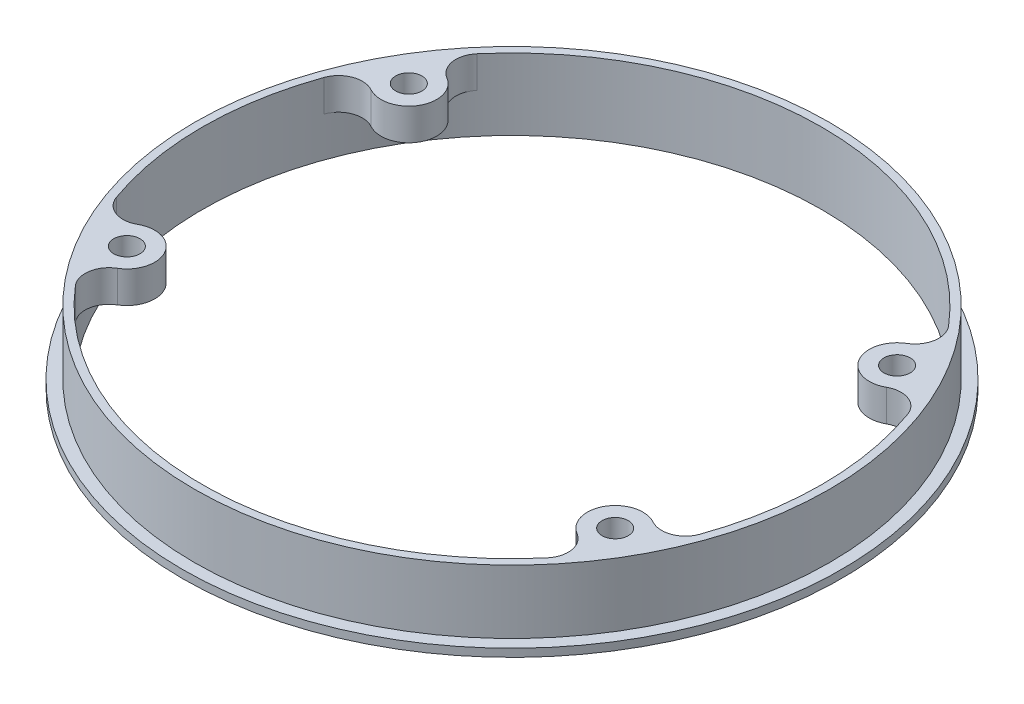
ISO-10303-21;
HEADER;
FILE_DESCRIPTION(('STEP AP214'),'2;1');
FILE_NAME('part.step','',(''),(''),'','','');
FILE_SCHEMA(('AUTOMOTIVE_DESIGN { 1 0 10303 214 1 1 1 1 }'));
ENDSEC;
DATA;
#1=APPLICATION_CONTEXT('core data for automotive mechanical design processes');
#2=APPLICATION_PROTOCOL_DEFINITION('international standard','automotive_design',2000,#1);
#3=PRODUCT_CONTEXT('',#1,'mechanical');
#4=PRODUCT('Part','Part','',(#3));
#5=PRODUCT_RELATED_PRODUCT_CATEGORY('part','',(#4));
#6=PRODUCT_DEFINITION_FORMATION('','',#4);
#7=PRODUCT_DEFINITION_CONTEXT('part definition',#1,'design');
#8=PRODUCT_DEFINITION('design','',#6,#7);
#9=PRODUCT_DEFINITION_SHAPE('','',#8);
#10=(LENGTH_UNIT() NAMED_UNIT(*) SI_UNIT(.MILLI.,.METRE.));
#11=(NAMED_UNIT(*) PLANE_ANGLE_UNIT() SI_UNIT($,.RADIAN.));
#12=(NAMED_UNIT(*) SI_UNIT($,.STERADIAN.) SOLID_ANGLE_UNIT());
#13=UNCERTAINTY_MEASURE_WITH_UNIT(LENGTH_MEASURE(1.E-05),#10,'distance_accuracy_value','');
#14=(GEOMETRIC_REPRESENTATION_CONTEXT(3) GLOBAL_UNCERTAINTY_ASSIGNED_CONTEXT((#13)) GLOBAL_UNIT_ASSIGNED_CONTEXT((#10,
#11,#12)) REPRESENTATION_CONTEXT('',''));
#15=CARTESIAN_POINT('',(0.,0.,0.));
#16=DIRECTION('',(0.,0.,1.));
#17=DIRECTION('',(1.,0.,0.));
#18=AXIS2_PLACEMENT_3D('',#15,#16,#17);
#19=CARTESIAN_POINT('',(-32.,5.,0.));
#20=DIRECTION('',(0.,1.,0.));
#21=DIRECTION('',(0.,0.,1.));
#22=AXIS2_PLACEMENT_3D('',#19,#20,#21);
#23=PLANE('',#22);
#24=CARTESIAN_POINT('',(-30.7439018343476,5.,-17.75));
#25=DIRECTION('',(0.,1.,0.));
#26=DIRECTION('',(0.,0.,1.));
#27=AXIS2_PLACEMENT_3D('',#24,#25,#26);
#28=CIRCLE('',#27,1.65);
#29=CARTESIAN_POINT('',(-30.7439018343476,5.,-16.1));
#30=VERTEX_POINT('',#29);
#31=EDGE_CURVE('E268',#30,#30,#28,.T.);
#32=ORIENTED_EDGE('',*,*,#31,.T.);
#33=EDGE_LOOP('',(#32));
#34=FACE_BOUND('',#33,.T.);
#35=CARTESIAN_POINT('',(-30.7439018343476,5.,-17.75));
#36=DIRECTION('',(0.,1.,0.));
#37=DIRECTION('',(0.,0.,1.));
#38=AXIS2_PLACEMENT_3D('',#35,#36,#37);
#39=CIRCLE('',#38,3.50000000000001);
#40=CARTESIAN_POINT('',(-28.9513840264837,5.,-20.7561403673965));
#41=VERTEX_POINT('',#40);
#42=CARTESIAN_POINT('',(-32.4510368559229,5.,-14.6945638579556));
#43=VERTEX_POINT('',#42);
#44=EDGE_CURVE('E11',#41,#43,#39,.F.);
#45=ORIENTED_EDGE('',*,*,#44,.T.);
#46=CARTESIAN_POINT('',(-33.9142954458446,5.,-12.0756185933461));
#47=DIRECTION('',(0.,1.,0.));
#48=DIRECTION('',(0.,0.,1.));
#49=AXIS2_PLACEMENT_3D('',#46,#47,#48);
#50=CIRCLE('',#49,3.);
#51=CARTESIAN_POINT('',(-36.7404867329983,5.,-13.0819201427917));
#52=VERTEX_POINT('',#51);
#53=EDGE_CURVE('E262',#43,#52,#50,.T.);
#54=ORIENTED_EDGE('',*,*,#53,.T.);
#55=CARTESIAN_POINT('',(0.,5.,0.));
#56=DIRECTION('',(0.,-1.,0.));
#57=DIRECTION('',(0.,0.,-1.));
#58=AXIS2_PLACEMENT_3D('',#55,#56,#57);
#59=CIRCLE('',#58,39.);
#60=CARTESIAN_POINT('',(-29.699518540436,5.,-25.2772347867858));
#61=VERTEX_POINT('',#60);
#62=EDGE_CURVE('E295',#52,#61,#59,.T.);
#63=ORIENTED_EDGE('',*,*,#62,.T.);
#64=CARTESIAN_POINT('',(-27.4149401911717,5.,-23.3328321108792));
#65=DIRECTION('',(0.,1.,0.));
#66=DIRECTION('',(0.,0.,1.));
#67=AXIS2_PLACEMENT_3D('',#64,#65,#66);
#68=CIRCLE('',#67,3.);
#69=EDGE_CURVE('E259',#61,#41,#68,.T.);
#70=ORIENTED_EDGE('',*,*,#69,.T.);
#71=EDGE_LOOP('',(#45,#54,#63,#70));
#72=FACE_BOUND('',#71,.T.);
#73=ADVANCED_FACE('F38',(#34,#72),#23,.F.);
#74=CARTESIAN_POINT('',(30.7439018343476,5.,-17.75));
#75=DIRECTION('',(0.,1.,0.));
#76=DIRECTION('',(0.,0.,1.));
#77=AXIS2_PLACEMENT_3D('',#74,#75,#76);
#78=CIRCLE('',#77,1.65);
#79=CARTESIAN_POINT('',(30.7439018343476,5.,-16.1));
#80=VERTEX_POINT('',#79);
#81=EDGE_CURVE('E280',#80,#80,#78,.T.);
#82=ORIENTED_EDGE('',*,*,#81,.T.);
#83=EDGE_LOOP('',(#82));
#84=FACE_BOUND('',#83,.T.);
#85=CARTESIAN_POINT('',(30.7439018343477,5.,-17.7499999999999));
#86=DIRECTION('',(0.,1.,0.));
#87=DIRECTION('',(0.,0.,1.));
#88=AXIS2_PLACEMENT_3D('',#85,#86,#87);
#89=CIRCLE('',#88,3.50000000000001);
#90=CARTESIAN_POINT('',(32.4510368559229,5.,-14.6945638579555));
#91=VERTEX_POINT('',#90);
#92=CARTESIAN_POINT('',(28.9513840264838,5.,-20.7561403673964));
#93=VERTEX_POINT('',#92);
#94=EDGE_CURVE('E46',#91,#93,#89,.F.);
#95=ORIENTED_EDGE('',*,*,#94,.T.);
#96=CARTESIAN_POINT('',(27.4149401911718,5.,-23.3328321108791));
#97=DIRECTION('',(0.,1.,0.));
#98=DIRECTION('',(0.,0.,1.));
#99=AXIS2_PLACEMENT_3D('',#96,#97,#98);
#100=CIRCLE('',#99,3.);
#101=CARTESIAN_POINT('',(29.6995185404362,5.,-25.2772347867857));
#102=VERTEX_POINT('',#101);
#103=EDGE_CURVE('E256',#93,#102,#100,.T.);
#104=ORIENTED_EDGE('',*,*,#103,.T.);
#105=CARTESIAN_POINT('',(36.7404867329983,5.,-13.0819201427915));
#106=VERTEX_POINT('',#105);
#107=EDGE_CURVE('E296',#102,#106,#59,.T.);
#108=ORIENTED_EDGE('',*,*,#107,.T.);
#109=CARTESIAN_POINT('',(33.9142954458446,5.,-12.075618593346));
#110=DIRECTION('',(0.,1.,0.));
#111=DIRECTION('',(0.,0.,1.));
#112=AXIS2_PLACEMENT_3D('',#109,#110,#111);
#113=CIRCLE('',#112,3.);
#114=EDGE_CURVE('E253',#106,#91,#113,.T.);
#115=ORIENTED_EDGE('',*,*,#114,.T.);
#116=EDGE_LOOP('',(#95,#104,#108,#115));
#117=FACE_BOUND('',#116,.T.);
#118=ADVANCED_FACE('F314',(#84,#117),#23,.F.);
#119=CARTESIAN_POINT('',(30.7439018343477,5.,17.7499999999997));
#120=DIRECTION('',(0.,1.,0.));
#121=DIRECTION('',(0.,0.,1.));
#122=AXIS2_PLACEMENT_3D('',#119,#120,#121);
#123=CIRCLE('',#122,1.65);
#124=CARTESIAN_POINT('',(30.7439018343477,5.,19.3999999999997));
#125=VERTEX_POINT('',#124);
#126=EDGE_CURVE('E276',#125,#125,#123,.T.);
#127=ORIENTED_EDGE('',*,*,#126,.T.);
#128=EDGE_LOOP('',(#127));
#129=FACE_BOUND('',#128,.T.);
#130=CARTESIAN_POINT('',(30.7439018343475,5.,17.7500000000002));
#131=DIRECTION('',(0.,1.,0.));
#132=DIRECTION('',(0.,0.,1.));
#133=AXIS2_PLACEMENT_3D('',#130,#131,#132);
#134=CIRCLE('',#133,3.50000000000001);
#135=CARTESIAN_POINT('',(28.9513840264835,5.,20.7561403673967));
#136=VERTEX_POINT('',#135);
#137=CARTESIAN_POINT('',(32.4510368559228,5.,14.6945638579558));
#138=VERTEX_POINT('',#137);
#139=EDGE_CURVE('E311',#136,#138,#134,.F.);
#140=ORIENTED_EDGE('',*,*,#139,.T.);
#141=CARTESIAN_POINT('',(33.9142954458445,5.,12.0756185933463));
#142=DIRECTION('',(0.,1.,0.));
#143=DIRECTION('',(0.,0.,1.));
#144=AXIS2_PLACEMENT_3D('',#141,#142,#143);
#145=CIRCLE('',#144,3.);
#146=CARTESIAN_POINT('',(36.7404867329982,5.,13.0819201427919));
#147=VERTEX_POINT('',#146);
#148=EDGE_CURVE('E250',#138,#147,#145,.T.);
#149=ORIENTED_EDGE('',*,*,#148,.T.);
#150=CARTESIAN_POINT('',(29.6995185404359,5.,25.277234786786));
#151=VERTEX_POINT('',#150);
#152=EDGE_CURVE('E300',#147,#151,#59,.T.);
#153=ORIENTED_EDGE('',*,*,#152,.T.);
#154=CARTESIAN_POINT('',(27.4149401911716,5.,23.3328321108794));
#155=DIRECTION('',(0.,1.,0.));
#156=DIRECTION('',(0.,0.,1.));
#157=AXIS2_PLACEMENT_3D('',#154,#155,#156);
#158=CIRCLE('',#157,3.);
#159=EDGE_CURVE('E247',#151,#136,#158,.T.);
#160=ORIENTED_EDGE('',*,*,#159,.T.);
#161=EDGE_LOOP('',(#140,#149,#153,#160));
#162=FACE_BOUND('',#161,.T.);
#163=ADVANCED_FACE('F380',(#129,#162),#23,.F.);
#164=CARTESIAN_POINT('',(0.,0.,0.));
#165=DIRECTION('',(0.,-1.,0.));
#166=DIRECTION('',(0.,0.,-1.));
#167=AXIS2_PLACEMENT_3D('',#164,#165,#166);
#168=CYLINDRICAL_SURFACE('',#167,40.);
#169=CARTESIAN_POINT('',(0.,1.,0.));
#170=DIRECTION('',(0.,-1.,0.));
#171=DIRECTION('',(0.,0.,-1.));
#172=AXIS2_PLACEMENT_3D('',#169,#170,#171);
#173=CIRCLE('',#172,40.);
#174=CARTESIAN_POINT('',(0.,1.,-40.));
#175=VERTEX_POINT('',#174);
#176=EDGE_CURVE('E283',#175,#175,#173,.T.);
#177=ORIENTED_EDGE('',*,*,#176,.F.);
#178=EDGE_LOOP('',(#177));
#179=FACE_BOUND('',#178,.T.);
#180=CARTESIAN_POINT('',(0.,9.,0.));
#181=DIRECTION('',(0.,-1.,0.));
#182=DIRECTION('',(0.,0.,-1.));
#183=AXIS2_PLACEMENT_3D('',#180,#181,#182);
#184=CIRCLE('',#183,40.);
#185=CARTESIAN_POINT('',(0.,9.,-40.));
#186=VERTEX_POINT('',#185);
#187=EDGE_CURVE('E299',#186,#186,#184,.T.);
#188=ORIENTED_EDGE('',*,*,#187,.T.);
#189=EDGE_LOOP('',(#188));
#190=FACE_BOUND('',#189,.T.);
#191=ADVANCED_FACE('F40',(#179,#190),#168,.T.);
#192=CARTESIAN_POINT('',(-40.,9.,0.));
#193=DIRECTION('',(0.,-1.,0.));
#194=DIRECTION('',(0.,0.,-1.));
#195=AXIS2_PLACEMENT_3D('',#192,#193,#194);
#196=PLANE('',#195);
#197=CARTESIAN_POINT('',(-30.7439018343476,9.,-17.75));
#198=DIRECTION('',(0.,1.,0.));
#199=DIRECTION('',(0.,0.,1.));
#200=AXIS2_PLACEMENT_3D('',#197,#198,#199);
#201=CIRCLE('',#200,1.65);
#202=CARTESIAN_POINT('',(-30.7439018343476,9.,-16.1));
#203=VERTEX_POINT('',#202);
#204=EDGE_CURVE('E265',#203,#203,#201,.T.);
#205=ORIENTED_EDGE('',*,*,#204,.F.);
#206=EDGE_LOOP('',(#205));
#207=FACE_BOUND('',#206,.T.);
#208=CARTESIAN_POINT('',(-30.7439018343472,9.,17.7500000000006));
#209=DIRECTION('',(0.,1.,0.));
#210=DIRECTION('',(0.,0.,1.));
#211=AXIS2_PLACEMENT_3D('',#208,#209,#210);
#212=CIRCLE('',#211,1.65);
#213=CARTESIAN_POINT('',(-30.7439018343472,9.,19.4000000000006));
#214=VERTEX_POINT('',#213);
#215=EDGE_CURVE('E269',#214,#214,#212,.T.);
#216=ORIENTED_EDGE('',*,*,#215,.F.);
#217=EDGE_LOOP('',(#216));
#218=FACE_BOUND('',#217,.T.);
#219=CARTESIAN_POINT('',(30.7439018343477,9.,17.7499999999997));
#220=DIRECTION('',(0.,1.,0.));
#221=DIRECTION('',(0.,0.,1.));
#222=AXIS2_PLACEMENT_3D('',#219,#220,#221);
#223=CIRCLE('',#222,1.65);
#224=CARTESIAN_POINT('',(30.7439018343477,9.,19.3999999999997));
#225=VERTEX_POINT('',#224);
#226=EDGE_CURVE('E273',#225,#225,#223,.T.);
#227=ORIENTED_EDGE('',*,*,#226,.F.);
#228=EDGE_LOOP('',(#227));
#229=FACE_BOUND('',#228,.T.);
#230=CARTESIAN_POINT('',(30.7439018343476,9.,-17.75));
#231=DIRECTION('',(0.,1.,0.));
#232=DIRECTION('',(0.,0.,1.));
#233=AXIS2_PLACEMENT_3D('',#230,#231,#232);
#234=CIRCLE('',#233,1.65);
#235=CARTESIAN_POINT('',(30.7439018343476,9.,-16.1));
#236=VERTEX_POINT('',#235);
#237=EDGE_CURVE('E277',#236,#236,#234,.T.);
#238=ORIENTED_EDGE('',*,*,#237,.F.);
#239=EDGE_LOOP('',(#238));
#240=FACE_BOUND('',#239,.T.);
#241=ORIENTED_EDGE('',*,*,#187,.F.);
#242=EDGE_LOOP('',(#241));
#243=FACE_BOUND('',#242,.T.);
#244=CARTESIAN_POINT('',(0.,9.,0.));
#245=DIRECTION('',(0.,1.,0.));
#246=DIRECTION('',(0.,0.,1.));
#247=AXIS2_PLACEMENT_3D('',#244,#245,#246);
#248=CIRCLE('',#247,39.);
#249=CARTESIAN_POINT('',(-36.7404867329983,9.,-13.0819201427917));
#250=VERTEX_POINT('',#249);
#251=CARTESIAN_POINT('',(-36.7404867329984,9.,13.0819201427912));
#252=VERTEX_POINT('',#251);
#253=EDGE_CURVE('E162',#250,#252,#248,.T.);
#254=ORIENTED_EDGE('',*,*,#253,.F.);
#255=CARTESIAN_POINT('',(-33.9142954458446,9.,-12.0756185933461));
#256=DIRECTION('',(0.,1.,0.));
#257=DIRECTION('',(0.,0.,1.));
#258=AXIS2_PLACEMENT_3D('',#255,#256,#257);
#259=CIRCLE('',#258,3.);
#260=CARTESIAN_POINT('',(-32.4510368559229,9.,-14.6945638579556));
#261=VERTEX_POINT('',#260);
#262=EDGE_CURVE('E53',#261,#250,#259,.T.);
#263=ORIENTED_EDGE('',*,*,#262,.F.);
#264=CARTESIAN_POINT('',(-30.7439018343476,9.,-17.75));
#265=DIRECTION('',(0.,-1.,0.));
#266=DIRECTION('',(0.,0.,1.));
#267=AXIS2_PLACEMENT_3D('',#264,#265,#266);
#268=CIRCLE('',#267,3.50000000000001);
#269=CARTESIAN_POINT('',(-28.9513840264837,9.,-20.7561403673965));
#270=VERTEX_POINT('',#269);
#271=EDGE_CURVE('E208',#270,#261,#268,.T.);
#272=ORIENTED_EDGE('',*,*,#271,.F.);
#273=CARTESIAN_POINT('',(-27.4149401911717,9.,-23.3328321108792));
#274=DIRECTION('',(0.,1.,0.));
#275=DIRECTION('',(0.,0.,-1.));
#276=AXIS2_PLACEMENT_3D('',#273,#274,#275);
#277=CIRCLE('',#276,3.);
#278=CARTESIAN_POINT('',(-29.699518540436,9.,-25.2772347867858));
#279=VERTEX_POINT('',#278);
#280=EDGE_CURVE('E205',#279,#270,#277,.T.);
#281=ORIENTED_EDGE('',*,*,#280,.F.);
#282=CARTESIAN_POINT('',(0.,9.,0.));
#283=DIRECTION('',(0.,1.,0.));
#284=DIRECTION('',(0.,0.,1.));
#285=AXIS2_PLACEMENT_3D('',#282,#283,#284);
#286=CIRCLE('',#285,39.);
#287=CARTESIAN_POINT('',(29.6995185404362,9.,-25.2772347867857));
#288=VERTEX_POINT('',#287);
#289=EDGE_CURVE('E202',#288,#279,#286,.T.);
#290=ORIENTED_EDGE('',*,*,#289,.F.);
#291=CARTESIAN_POINT('',(27.4149401911718,9.,-23.3328321108791));
#292=DIRECTION('',(0.,1.,0.));
#293=DIRECTION('',(0.,0.,1.));
#294=AXIS2_PLACEMENT_3D('',#291,#292,#293);
#295=CIRCLE('',#294,3.);
#296=CARTESIAN_POINT('',(28.9513840264838,9.,-20.7561403673964));
#297=VERTEX_POINT('',#296);
#298=EDGE_CURVE('E199',#297,#288,#295,.T.);
#299=ORIENTED_EDGE('',*,*,#298,.F.);
#300=CARTESIAN_POINT('',(30.7439018343477,9.,-17.7499999999999));
#301=DIRECTION('',(0.,-1.,0.));
#302=DIRECTION('',(0.,0.,1.));
#303=AXIS2_PLACEMENT_3D('',#300,#301,#302);
#304=CIRCLE('',#303,3.50000000000001);
#305=CARTESIAN_POINT('',(32.4510368559229,9.,-14.6945638579555));
#306=VERTEX_POINT('',#305);
#307=EDGE_CURVE('E196',#306,#297,#304,.T.);
#308=ORIENTED_EDGE('',*,*,#307,.F.);
#309=CARTESIAN_POINT('',(33.9142954458446,9.,-12.075618593346));
#310=DIRECTION('',(0.,1.,0.));
#311=DIRECTION('',(0.,0.,-1.));
#312=AXIS2_PLACEMENT_3D('',#309,#310,#311);
#313=CIRCLE('',#312,3.);
#314=CARTESIAN_POINT('',(36.7404867329983,9.,-13.0819201427915));
#315=VERTEX_POINT('',#314);
#316=EDGE_CURVE('E193',#315,#306,#313,.T.);
#317=ORIENTED_EDGE('',*,*,#316,.F.);
#318=CARTESIAN_POINT('',(0.,9.,0.));
#319=DIRECTION('',(0.,1.,0.));
#320=DIRECTION('',(0.,0.,1.));
#321=AXIS2_PLACEMENT_3D('',#318,#319,#320);
#322=CIRCLE('',#321,39.);
#323=CARTESIAN_POINT('',(36.7404867329982,9.,13.0819201427919));
#324=VERTEX_POINT('',#323);
#325=EDGE_CURVE('E190',#324,#315,#322,.T.);
#326=ORIENTED_EDGE('',*,*,#325,.F.);
#327=CARTESIAN_POINT('',(33.9142954458445,9.,12.0756185933463));
#328=DIRECTION('',(0.,1.,0.));
#329=DIRECTION('',(0.,0.,1.));
#330=AXIS2_PLACEMENT_3D('',#327,#328,#329);
#331=CIRCLE('',#330,3.);
#332=CARTESIAN_POINT('',(32.4510368559228,9.,14.6945638579558));
#333=VERTEX_POINT('',#332);
#334=EDGE_CURVE('E187',#333,#324,#331,.T.);
#335=ORIENTED_EDGE('',*,*,#334,.F.);
#336=CARTESIAN_POINT('',(30.7439018343475,9.,17.7500000000002));
#337=DIRECTION('',(0.,-1.,0.));
#338=DIRECTION('',(0.,0.,1.));
#339=AXIS2_PLACEMENT_3D('',#336,#337,#338);
#340=CIRCLE('',#339,3.50000000000001);
#341=CARTESIAN_POINT('',(28.9513840264835,9.,20.7561403673967));
#342=VERTEX_POINT('',#341);
#343=EDGE_CURVE('E184',#342,#333,#340,.T.);
#344=ORIENTED_EDGE('',*,*,#343,.F.);
#345=CARTESIAN_POINT('',(27.4149401911716,9.,23.3328321108794));
#346=DIRECTION('',(0.,1.,0.));
#347=DIRECTION('',(0.,0.,-1.));
#348=AXIS2_PLACEMENT_3D('',#345,#346,#347);
#349=CIRCLE('',#348,3.);
#350=CARTESIAN_POINT('',(29.6995185404359,9.,25.277234786786));
#351=VERTEX_POINT('',#350);
#352=EDGE_CURVE('E181',#351,#342,#349,.T.);
#353=ORIENTED_EDGE('',*,*,#352,.F.);
#354=CARTESIAN_POINT('',(0.,9.,0.));
#355=DIRECTION('',(0.,1.,0.));
#356=DIRECTION('',(0.,0.,1.));
#357=AXIS2_PLACEMENT_3D('',#354,#355,#356);
#358=CIRCLE('',#357,39.);
#359=CARTESIAN_POINT('',(-29.6995185404363,9.,25.2772347867855));
#360=VERTEX_POINT('',#359);
#361=EDGE_CURVE('E178',#360,#351,#358,.T.);
#362=ORIENTED_EDGE('',*,*,#361,.F.);
#363=CARTESIAN_POINT('',(-27.414940191172,9.,23.3328321108789));
#364=DIRECTION('',(0.,1.,0.));
#365=DIRECTION('',(0.,0.,1.));
#366=AXIS2_PLACEMENT_3D('',#363,#364,#365);
#367=CIRCLE('',#366,3.);
#368=CARTESIAN_POINT('',(-28.9513840264839,9.,20.7561403673962));
#369=VERTEX_POINT('',#368);
#370=EDGE_CURVE('E172',#369,#360,#367,.T.);
#371=ORIENTED_EDGE('',*,*,#370,.F.);
#372=CARTESIAN_POINT('',(-30.7439018343478,9.,17.7499999999996));
#373=DIRECTION('',(0.,-1.,0.));
#374=DIRECTION('',(0.,0.,1.));
#375=AXIS2_PLACEMENT_3D('',#372,#373,#374);
#376=CIRCLE('',#375,3.50000000000001);
#377=CARTESIAN_POINT('',(-32.4510368559231,9.,14.6945638579552));
#378=VERTEX_POINT('',#377);
#379=EDGE_CURVE('E170',#378,#369,#376,.T.);
#380=ORIENTED_EDGE('',*,*,#379,.F.);
#381=CARTESIAN_POINT('',(-33.9142954458447,9.,12.0756185933457));
#382=DIRECTION('',(0.,1.,0.));
#383=DIRECTION('',(0.,0.,-1.));
#384=AXIS2_PLACEMENT_3D('',#381,#382,#383);
#385=CIRCLE('',#384,3.);
#386=EDGE_CURVE('E153',#252,#378,#385,.T.);
#387=ORIENTED_EDGE('',*,*,#386,.F.);
#388=EDGE_LOOP('',(#254,#263,#272,#281,#290,#299,#308,#317,#326,#335,#344,#353,#362,#371,#380,#387));
#389=FACE_BOUND('',#388,.T.);
#390=ADVANCED_FACE('F168',(#207,#218,#229,#240,#243,#389),#196,.F.);
#391=CARTESIAN_POINT('',(-30.7439018343472,5.,17.7500000000006));
#392=DIRECTION('',(0.,1.,0.));
#393=DIRECTION('',(0.,0.,1.));
#394=AXIS2_PLACEMENT_3D('',#391,#392,#393);
#395=CIRCLE('',#394,1.65);
#396=CARTESIAN_POINT('',(-30.7439018343472,5.,19.4000000000006));
#397=VERTEX_POINT('',#396);
#398=EDGE_CURVE('E272',#397,#397,#395,.T.);
#399=ORIENTED_EDGE('',*,*,#398,.T.);
#400=EDGE_LOOP('',(#399));
#401=FACE_BOUND('',#400,.T.);
#402=CARTESIAN_POINT('',(-30.7439018343478,5.,17.7499999999996));
#403=DIRECTION('',(0.,1.,0.));
#404=DIRECTION('',(0.,0.,1.));
#405=AXIS2_PLACEMENT_3D('',#402,#403,#404);
#406=CIRCLE('',#405,3.50000000000001);
#407=CARTESIAN_POINT('',(-32.4510368559231,5.,14.6945638579552));
#408=VERTEX_POINT('',#407);
#409=CARTESIAN_POINT('',(-28.9513840264839,5.,20.7561403673962));
#410=VERTEX_POINT('',#409);
#411=EDGE_CURVE('E303',#408,#410,#406,.F.);
#412=ORIENTED_EDGE('',*,*,#411,.T.);
#413=CARTESIAN_POINT('',(-27.414940191172,5.,23.3328321108789));
#414=DIRECTION('',(0.,1.,0.));
#415=DIRECTION('',(0.,0.,1.));
#416=AXIS2_PLACEMENT_3D('',#413,#414,#415);
#417=CIRCLE('',#416,3.);
#418=CARTESIAN_POINT('',(-29.6995185404363,5.,25.2772347867855));
#419=VERTEX_POINT('',#418);
#420=EDGE_CURVE('E244',#410,#419,#417,.T.);
#421=ORIENTED_EDGE('',*,*,#420,.T.);
#422=CARTESIAN_POINT('',(-36.7404867329984,5.,13.0819201427912));
#423=VERTEX_POINT('',#422);
#424=EDGE_CURVE('E347',#419,#423,#59,.T.);
#425=ORIENTED_EDGE('',*,*,#424,.T.);
#426=CARTESIAN_POINT('',(-33.9142954458447,5.,12.0756185933457));
#427=DIRECTION('',(0.,1.,0.));
#428=DIRECTION('',(0.,0.,1.));
#429=AXIS2_PLACEMENT_3D('',#426,#427,#428);
#430=CIRCLE('',#429,3.);
#431=EDGE_CURVE('E156',#423,#408,#430,.T.);
#432=ORIENTED_EDGE('',*,*,#431,.T.);
#433=EDGE_LOOP('',(#412,#421,#425,#432));
#434=FACE_BOUND('',#433,.T.);
#435=ADVANCED_FACE('F355',(#401,#434),#23,.F.);
#436=CARTESIAN_POINT('',(0.,0.,0.));
#437=DIRECTION('',(0.,-1.,0.));
#438=DIRECTION('',(0.,0.,-1.));
#439=AXIS2_PLACEMENT_3D('',#436,#437,#438);
#440=CYLINDRICAL_SURFACE('',#439,39.);
#441=ORIENTED_EDGE('',*,*,#62,.F.);
#442=DIRECTION('',(0.,1.,0.));
#443=VECTOR('',#442,1.);
#444=CARTESIAN_POINT('',(-36.7404867329983,0.,-13.0819201427917));
#445=LINE('',#444,#443);
#446=EDGE_CURVE('E159',#52,#250,#445,.T.);
#447=ORIENTED_EDGE('',*,*,#446,.T.);
#448=ORIENTED_EDGE('',*,*,#253,.T.);
#449=DIRECTION('',(0.,1.,0.));
#450=VECTOR('',#449,1.);
#451=CARTESIAN_POINT('',(-36.7404867329984,0.,13.0819201427912));
#452=LINE('',#451,#450);
#453=EDGE_CURVE('E61',#423,#252,#452,.T.);
#454=ORIENTED_EDGE('',*,*,#453,.F.);
#455=ORIENTED_EDGE('',*,*,#424,.F.);
#456=DIRECTION('',(0.,1.,0.));
#457=VECTOR('',#456,1.);
#458=CARTESIAN_POINT('',(-29.6995185404363,0.,25.2772347867855));
#459=LINE('',#458,#457);
#460=EDGE_CURVE('E236',#419,#360,#459,.T.);
#461=ORIENTED_EDGE('',*,*,#460,.T.);
#462=ORIENTED_EDGE('',*,*,#361,.T.);
#463=DIRECTION('',(0.,1.,0.));
#464=VECTOR('',#463,1.);
#465=CARTESIAN_POINT('',(29.6995185404359,0.,25.277234786786));
#466=LINE('',#465,#464);
#467=EDGE_CURVE('E234',#151,#351,#466,.T.);
#468=ORIENTED_EDGE('',*,*,#467,.F.);
#469=ORIENTED_EDGE('',*,*,#152,.F.);
#470=DIRECTION('',(0.,1.,0.));
#471=VECTOR('',#470,1.);
#472=CARTESIAN_POINT('',(36.7404867329982,0.,13.0819201427919));
#473=LINE('',#472,#471);
#474=EDGE_CURVE('E227',#147,#324,#473,.T.);
#475=ORIENTED_EDGE('',*,*,#474,.T.);
#476=ORIENTED_EDGE('',*,*,#325,.T.);
#477=DIRECTION('',(0.,1.,0.));
#478=VECTOR('',#477,1.);
#479=CARTESIAN_POINT('',(36.7404867329983,0.,-13.0819201427915));
#480=LINE('',#479,#478);
#481=EDGE_CURVE('E225',#106,#315,#480,.T.);
#482=ORIENTED_EDGE('',*,*,#481,.F.);
#483=ORIENTED_EDGE('',*,*,#107,.F.);
#484=DIRECTION('',(0.,1.,0.));
#485=VECTOR('',#484,1.);
#486=CARTESIAN_POINT('',(29.6995185404362,0.,-25.2772347867857));
#487=LINE('',#486,#485);
#488=EDGE_CURVE('E218',#102,#288,#487,.T.);
#489=ORIENTED_EDGE('',*,*,#488,.T.);
#490=ORIENTED_EDGE('',*,*,#289,.T.);
#491=DIRECTION('',(0.,1.,0.));
#492=VECTOR('',#491,1.);
#493=CARTESIAN_POINT('',(-29.699518540436,0.,-25.2772347867858));
#494=LINE('',#493,#492);
#495=EDGE_CURVE('E216',#61,#279,#494,.T.);
#496=ORIENTED_EDGE('',*,*,#495,.F.);
#497=EDGE_LOOP('',(#441,#447,#448,#454,#455,#461,#462,#468,#469,#475,#476,#482,#483,#489,#490,#496));
#498=FACE_BOUND('',#497,.T.);
#499=CARTESIAN_POINT('',(0.,0.,0.));
#500=DIRECTION('',(0.,-1.,0.));
#501=DIRECTION('',(0.,0.,-1.));
#502=AXIS2_PLACEMENT_3D('',#499,#500,#501);
#503=CIRCLE('',#502,39.);
#504=CARTESIAN_POINT('',(0.,0.,-39.));
#505=VERTEX_POINT('',#504);
#506=EDGE_CURVE('E292',#505,#505,#503,.T.);
#507=ORIENTED_EDGE('',*,*,#506,.T.);
#508=EDGE_LOOP('',(#507));
#509=FACE_BOUND('',#508,.T.);
#510=ADVANCED_FACE('F164',(#498,#509),#440,.F.);
#511=CARTESIAN_POINT('',(-41.5,0.,0.));
#512=DIRECTION('',(0.,1.,0.));
#513=DIRECTION('',(0.,0.,1.));
#514=AXIS2_PLACEMENT_3D('',#511,#512,#513);
#515=PLANE('',#514);
#516=ORIENTED_EDGE('',*,*,#506,.F.);
#517=EDGE_LOOP('',(#516));
#518=FACE_BOUND('',#517,.T.);
#519=CARTESIAN_POINT('',(0.,0.,0.));
#520=DIRECTION('',(0.,-1.,0.));
#521=DIRECTION('',(0.,0.,-1.));
#522=AXIS2_PLACEMENT_3D('',#519,#520,#521);
#523=CIRCLE('',#522,41.5);
#524=CARTESIAN_POINT('',(0.,0.,-41.5));
#525=VERTEX_POINT('',#524);
#526=EDGE_CURVE('E289',#525,#525,#523,.T.);
#527=ORIENTED_EDGE('',*,*,#526,.T.);
#528=EDGE_LOOP('',(#527));
#529=FACE_BOUND('',#528,.T.);
#530=ADVANCED_FACE('F389',(#518,#529),#515,.F.);
#531=CARTESIAN_POINT('',(0.,0.,0.));
#532=DIRECTION('',(0.,-1.,0.));
#533=DIRECTION('',(0.,0.,-1.));
#534=AXIS2_PLACEMENT_3D('',#531,#532,#533);
#535=CYLINDRICAL_SURFACE('',#534,41.5);
#536=ORIENTED_EDGE('',*,*,#526,.F.);
#537=EDGE_LOOP('',(#536));
#538=FACE_BOUND('',#537,.T.);
#539=CARTESIAN_POINT('',(0.,1.,0.));
#540=DIRECTION('',(0.,-1.,0.));
#541=DIRECTION('',(0.,0.,-1.));
#542=AXIS2_PLACEMENT_3D('',#539,#540,#541);
#543=CIRCLE('',#542,41.5);
#544=CARTESIAN_POINT('',(0.,1.,-41.5));
#545=VERTEX_POINT('',#544);
#546=EDGE_CURVE('E286',#545,#545,#543,.T.);
#547=ORIENTED_EDGE('',*,*,#546,.T.);
#548=EDGE_LOOP('',(#547));
#549=FACE_BOUND('',#548,.T.);
#550=ADVANCED_FACE('F420',(#538,#549),#535,.T.);
#551=CARTESIAN_POINT('',(-40.,1.,0.));
#552=DIRECTION('',(0.,-1.,0.));
#553=DIRECTION('',(0.,0.,-1.));
#554=AXIS2_PLACEMENT_3D('',#551,#552,#553);
#555=PLANE('',#554);
#556=ORIENTED_EDGE('',*,*,#546,.F.);
#557=EDGE_LOOP('',(#556));
#558=FACE_BOUND('',#557,.T.);
#559=ORIENTED_EDGE('',*,*,#176,.T.);
#560=EDGE_LOOP('',(#559));
#561=FACE_BOUND('',#560,.T.);
#562=ADVANCED_FACE('F413',(#558,#561),#555,.F.);
#563=CARTESIAN_POINT('',(30.7439018343476,9.,-17.75));
#564=DIRECTION('',(0.,1.,0.));
#565=DIRECTION('',(0.,0.,1.));
#566=AXIS2_PLACEMENT_3D('',#563,#564,#565);
#567=CYLINDRICAL_SURFACE('',#566,1.65);
#568=ORIENTED_EDGE('',*,*,#237,.T.);
#569=EDGE_LOOP('',(#568));
#570=FACE_BOUND('',#569,.T.);
#571=ORIENTED_EDGE('',*,*,#81,.F.);
#572=EDGE_LOOP('',(#571));
#573=FACE_BOUND('',#572,.T.);
#574=ADVANCED_FACE('F403',(#570,#573),#567,.F.);
#575=CARTESIAN_POINT('',(30.7439018343477,9.,17.7499999999997));
#576=DIRECTION('',(0.,1.,0.));
#577=DIRECTION('',(0.,0.,1.));
#578=AXIS2_PLACEMENT_3D('',#575,#576,#577);
#579=CYLINDRICAL_SURFACE('',#578,1.65);
#580=ORIENTED_EDGE('',*,*,#226,.T.);
#581=EDGE_LOOP('',(#580));
#582=FACE_BOUND('',#581,.T.);
#583=ORIENTED_EDGE('',*,*,#126,.F.);
#584=EDGE_LOOP('',(#583));
#585=FACE_BOUND('',#584,.T.);
#586=ADVANCED_FACE('F400',(#582,#585),#579,.F.);
#587=CARTESIAN_POINT('',(-30.7439018343472,9.,17.7500000000006));
#588=DIRECTION('',(0.,1.,0.));
#589=DIRECTION('',(0.,0.,1.));
#590=AXIS2_PLACEMENT_3D('',#587,#588,#589);
#591=CYLINDRICAL_SURFACE('',#590,1.65);
#592=ORIENTED_EDGE('',*,*,#215,.T.);
#593=EDGE_LOOP('',(#592));
#594=FACE_BOUND('',#593,.T.);
#595=ORIENTED_EDGE('',*,*,#398,.F.);
#596=EDGE_LOOP('',(#595));
#597=FACE_BOUND('',#596,.T.);
#598=ADVANCED_FACE('F402',(#594,#597),#591,.F.);
#599=CARTESIAN_POINT('',(-30.7439018343476,9.,-17.75));
#600=DIRECTION('',(0.,1.,0.));
#601=DIRECTION('',(0.,0.,1.));
#602=AXIS2_PLACEMENT_3D('',#599,#600,#601);
#603=CYLINDRICAL_SURFACE('',#602,1.65);
#604=ORIENTED_EDGE('',*,*,#204,.T.);
#605=EDGE_LOOP('',(#604));
#606=FACE_BOUND('',#605,.T.);
#607=ORIENTED_EDGE('',*,*,#31,.F.);
#608=EDGE_LOOP('',(#607));
#609=FACE_BOUND('',#608,.T.);
#610=ADVANCED_FACE('F410',(#606,#609),#603,.F.);
#611=CARTESIAN_POINT('',(-30.7439018343476,0.,-17.75));
#612=DIRECTION('',(0.,1.,0.));
#613=DIRECTION('',(0.,0.,1.));
#614=AXIS2_PLACEMENT_3D('',#611,#612,#613);
#615=CYLINDRICAL_SURFACE('',#614,3.50000000000001);
#616=ORIENTED_EDGE('',*,*,#44,.F.);
#617=DIRECTION('',(0.,1.,0.));
#618=VECTOR('',#617,1.);
#619=CARTESIAN_POINT('',(-28.9513840264837,0.,-20.7561403673965));
#620=LINE('',#619,#618);
#621=EDGE_CURVE('E213',#41,#270,#620,.T.);
#622=ORIENTED_EDGE('',*,*,#621,.T.);
#623=ORIENTED_EDGE('',*,*,#271,.T.);
#624=DIRECTION('',(0.,1.,0.));
#625=VECTOR('',#624,1.);
#626=CARTESIAN_POINT('',(-32.4510368559229,0.,-14.6945638579556));
#627=LINE('',#626,#625);
#628=EDGE_CURVE('E211',#43,#261,#627,.T.);
#629=ORIENTED_EDGE('',*,*,#628,.F.);
#630=EDGE_LOOP('',(#616,#622,#623,#629));
#631=FACE_BOUND('',#630,.T.);
#632=ADVANCED_FACE('F361',(#631),#615,.T.);
#633=CARTESIAN_POINT('',(30.7439018343477,0.,-17.7499999999999));
#634=DIRECTION('',(0.,1.,0.));
#635=DIRECTION('',(0.,0.,1.));
#636=AXIS2_PLACEMENT_3D('',#633,#634,#635);
#637=CYLINDRICAL_SURFACE('',#636,3.50000000000001);
#638=ORIENTED_EDGE('',*,*,#94,.F.);
#639=DIRECTION('',(0.,1.,0.));
#640=VECTOR('',#639,1.);
#641=CARTESIAN_POINT('',(32.4510368559229,0.,-14.6945638579555));
#642=LINE('',#641,#640);
#643=EDGE_CURVE('E222',#91,#306,#642,.T.);
#644=ORIENTED_EDGE('',*,*,#643,.T.);
#645=ORIENTED_EDGE('',*,*,#307,.T.);
#646=DIRECTION('',(0.,1.,0.));
#647=VECTOR('',#646,1.);
#648=CARTESIAN_POINT('',(28.9513840264838,0.,-20.7561403673964));
#649=LINE('',#648,#647);
#650=EDGE_CURVE('E220',#93,#297,#649,.T.);
#651=ORIENTED_EDGE('',*,*,#650,.F.);
#652=EDGE_LOOP('',(#638,#644,#645,#651));
#653=FACE_BOUND('',#652,.T.);
#654=ADVANCED_FACE('F321',(#653),#637,.T.);
#655=CARTESIAN_POINT('',(30.7439018343475,0.,17.7500000000002));
#656=DIRECTION('',(0.,1.,0.));
#657=DIRECTION('',(0.,0.,1.));
#658=AXIS2_PLACEMENT_3D('',#655,#656,#657);
#659=CYLINDRICAL_SURFACE('',#658,3.50000000000001);
#660=ORIENTED_EDGE('',*,*,#139,.F.);
#661=DIRECTION('',(0.,1.,0.));
#662=VECTOR('',#661,1.);
#663=CARTESIAN_POINT('',(28.9513840264835,0.,20.7561403673967));
#664=LINE('',#663,#662);
#665=EDGE_CURVE('E231',#136,#342,#664,.T.);
#666=ORIENTED_EDGE('',*,*,#665,.T.);
#667=ORIENTED_EDGE('',*,*,#343,.T.);
#668=DIRECTION('',(0.,1.,0.));
#669=VECTOR('',#668,1.);
#670=CARTESIAN_POINT('',(32.4510368559228,0.,14.6945638579558));
#671=LINE('',#670,#669);
#672=EDGE_CURVE('E229',#138,#333,#671,.T.);
#673=ORIENTED_EDGE('',*,*,#672,.F.);
#674=EDGE_LOOP('',(#660,#666,#667,#673));
#675=FACE_BOUND('',#674,.T.);
#676=ADVANCED_FACE('F339',(#675),#659,.T.);
#677=CARTESIAN_POINT('',(-30.7439018343478,0.,17.7499999999996));
#678=DIRECTION('',(0.,1.,0.));
#679=DIRECTION('',(0.,0.,1.));
#680=AXIS2_PLACEMENT_3D('',#677,#678,#679);
#681=CYLINDRICAL_SURFACE('',#680,3.50000000000001);
#682=ORIENTED_EDGE('',*,*,#411,.F.);
#683=DIRECTION('',(0.,1.,0.));
#684=VECTOR('',#683,1.);
#685=CARTESIAN_POINT('',(-32.4510368559231,0.,14.6945638579552));
#686=LINE('',#685,#684);
#687=EDGE_CURVE('E158',#408,#378,#686,.T.);
#688=ORIENTED_EDGE('',*,*,#687,.T.);
#689=ORIENTED_EDGE('',*,*,#379,.T.);
#690=DIRECTION('',(0.,1.,0.));
#691=VECTOR('',#690,1.);
#692=CARTESIAN_POINT('',(-28.9513840264839,0.,20.7561403673962));
#693=LINE('',#692,#691);
#694=EDGE_CURVE('E238',#410,#369,#693,.T.);
#695=ORIENTED_EDGE('',*,*,#694,.F.);
#696=EDGE_LOOP('',(#682,#688,#689,#695));
#697=FACE_BOUND('',#696,.T.);
#698=ADVANCED_FACE('F353',(#697),#681,.T.);
#699=CARTESIAN_POINT('',(-33.9142954458446,0.,-12.0756185933461));
#700=DIRECTION('',(0.,1.,0.));
#701=DIRECTION('',(0.,0.,1.));
#702=AXIS2_PLACEMENT_3D('',#699,#700,#701);
#703=CYLINDRICAL_SURFACE('',#702,3.);
#704=ORIENTED_EDGE('',*,*,#628,.T.);
#705=ORIENTED_EDGE('',*,*,#262,.T.);
#706=ORIENTED_EDGE('',*,*,#446,.F.);
#707=ORIENTED_EDGE('',*,*,#53,.F.);
#708=EDGE_LOOP('',(#704,#705,#706,#707));
#709=FACE_BOUND('',#708,.T.);
#710=ADVANCED_FACE('F359',(#709),#703,.F.);
#711=CARTESIAN_POINT('',(-27.4149401911717,0.,-23.3328321108792));
#712=DIRECTION('',(0.,1.,0.));
#713=DIRECTION('',(0.,0.,1.));
#714=AXIS2_PLACEMENT_3D('',#711,#712,#713);
#715=CYLINDRICAL_SURFACE('',#714,3.);
#716=ORIENTED_EDGE('',*,*,#495,.T.);
#717=ORIENTED_EDGE('',*,*,#280,.T.);
#718=ORIENTED_EDGE('',*,*,#621,.F.);
#719=ORIENTED_EDGE('',*,*,#69,.F.);
#720=EDGE_LOOP('',(#716,#717,#718,#719));
#721=FACE_BOUND('',#720,.T.);
#722=ADVANCED_FACE('F364',(#721),#715,.F.);
#723=CARTESIAN_POINT('',(27.4149401911718,0.,-23.3328321108791));
#724=DIRECTION('',(0.,1.,0.));
#725=DIRECTION('',(0.,0.,1.));
#726=AXIS2_PLACEMENT_3D('',#723,#724,#725);
#727=CYLINDRICAL_SURFACE('',#726,3.);
#728=ORIENTED_EDGE('',*,*,#650,.T.);
#729=ORIENTED_EDGE('',*,*,#298,.T.);
#730=ORIENTED_EDGE('',*,*,#488,.F.);
#731=ORIENTED_EDGE('',*,*,#103,.F.);
#732=EDGE_LOOP('',(#728,#729,#730,#731));
#733=FACE_BOUND('',#732,.T.);
#734=ADVANCED_FACE('F320',(#733),#727,.F.);
#735=CARTESIAN_POINT('',(33.9142954458446,0.,-12.075618593346));
#736=DIRECTION('',(0.,1.,0.));
#737=DIRECTION('',(0.,0.,1.));
#738=AXIS2_PLACEMENT_3D('',#735,#736,#737);
#739=CYLINDRICAL_SURFACE('',#738,3.);
#740=ORIENTED_EDGE('',*,*,#481,.T.);
#741=ORIENTED_EDGE('',*,*,#316,.T.);
#742=ORIENTED_EDGE('',*,*,#643,.F.);
#743=ORIENTED_EDGE('',*,*,#114,.F.);
#744=EDGE_LOOP('',(#740,#741,#742,#743));
#745=FACE_BOUND('',#744,.T.);
#746=ADVANCED_FACE('F331',(#745),#739,.F.);
#747=CARTESIAN_POINT('',(33.9142954458445,0.,12.0756185933463));
#748=DIRECTION('',(0.,1.,0.));
#749=DIRECTION('',(0.,0.,1.));
#750=AXIS2_PLACEMENT_3D('',#747,#748,#749);
#751=CYLINDRICAL_SURFACE('',#750,3.);
#752=ORIENTED_EDGE('',*,*,#672,.T.);
#753=ORIENTED_EDGE('',*,*,#334,.T.);
#754=ORIENTED_EDGE('',*,*,#474,.F.);
#755=ORIENTED_EDGE('',*,*,#148,.F.);
#756=EDGE_LOOP('',(#752,#753,#754,#755));
#757=FACE_BOUND('',#756,.T.);
#758=ADVANCED_FACE('F335',(#757),#751,.F.);
#759=CARTESIAN_POINT('',(27.4149401911716,0.,23.3328321108794));
#760=DIRECTION('',(0.,1.,0.));
#761=DIRECTION('',(0.,0.,1.));
#762=AXIS2_PLACEMENT_3D('',#759,#760,#761);
#763=CYLINDRICAL_SURFACE('',#762,3.);
#764=ORIENTED_EDGE('',*,*,#467,.T.);
#765=ORIENTED_EDGE('',*,*,#352,.T.);
#766=ORIENTED_EDGE('',*,*,#665,.F.);
#767=ORIENTED_EDGE('',*,*,#159,.F.);
#768=EDGE_LOOP('',(#764,#765,#766,#767));
#769=FACE_BOUND('',#768,.T.);
#770=ADVANCED_FACE('F342',(#769),#763,.F.);
#771=CARTESIAN_POINT('',(-27.414940191172,0.,23.3328321108789));
#772=DIRECTION('',(0.,1.,0.));
#773=DIRECTION('',(0.,0.,1.));
#774=AXIS2_PLACEMENT_3D('',#771,#772,#773);
#775=CYLINDRICAL_SURFACE('',#774,3.);
#776=ORIENTED_EDGE('',*,*,#694,.T.);
#777=ORIENTED_EDGE('',*,*,#370,.T.);
#778=ORIENTED_EDGE('',*,*,#460,.F.);
#779=ORIENTED_EDGE('',*,*,#420,.F.);
#780=EDGE_LOOP('',(#776,#777,#778,#779));
#781=FACE_BOUND('',#780,.T.);
#782=ADVANCED_FACE('F350',(#781),#775,.F.);
#783=CARTESIAN_POINT('',(-33.9142954458447,0.,12.0756185933457));
#784=DIRECTION('',(0.,1.,0.));
#785=DIRECTION('',(0.,0.,1.));
#786=AXIS2_PLACEMENT_3D('',#783,#784,#785);
#787=CYLINDRICAL_SURFACE('',#786,3.);
#788=ORIENTED_EDGE('',*,*,#453,.T.);
#789=ORIENTED_EDGE('',*,*,#386,.T.);
#790=ORIENTED_EDGE('',*,*,#687,.F.);
#791=ORIENTED_EDGE('',*,*,#431,.F.);
#792=EDGE_LOOP('',(#788,#789,#790,#791));
#793=FACE_BOUND('',#792,.T.);
#794=ADVANCED_FACE('F150',(#793),#787,.F.);
#795=CLOSED_SHELL('',(#73,#118,#163,#191,#390,#435,#510,#530,#550,#562,#574,#586,#598,#610,#632,
#654,#676,#698,#710,#722,#734,#746,#758,#770,#782,#794));
#796=MANIFOLD_SOLID_BREP('B2',#795);
#797=ADVANCED_BREP_SHAPE_REPRESENTATION('',(#18,#796),#14);
#798=SHAPE_DEFINITION_REPRESENTATION(#9,#797);
ENDSEC;
END-ISO-10303-21;
